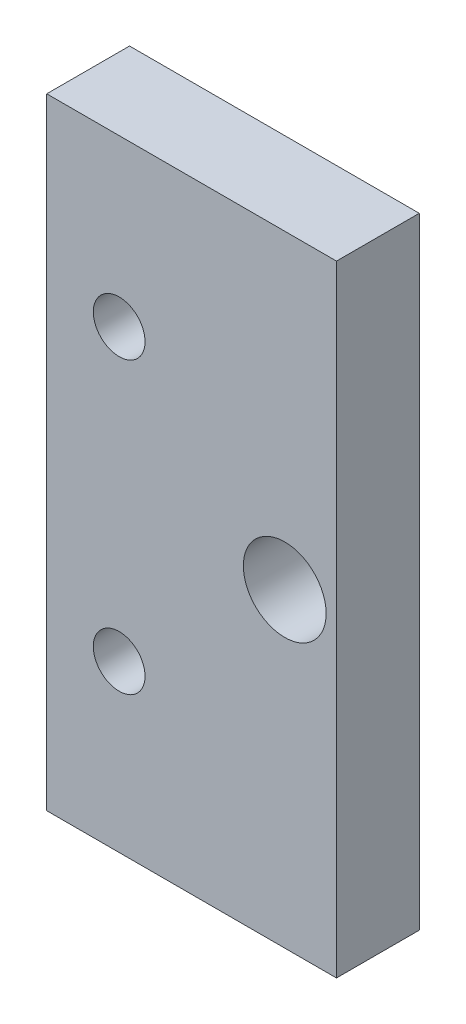
ISO-10303-21;
HEADER;
FILE_DESCRIPTION(('STEP AP214'),'2;1');
FILE_NAME('part.step','',(''),(''),'','','');
FILE_SCHEMA(('AUTOMOTIVE_DESIGN { 1 0 10303 214 1 1 1 1 }'));
ENDSEC;
DATA;
#1=APPLICATION_CONTEXT('core data for automotive mechanical design processes');
#2=APPLICATION_PROTOCOL_DEFINITION('international standard','automotive_design',2000,#1);
#3=PRODUCT_CONTEXT('',#1,'mechanical');
#4=PRODUCT('Part','Part','',(#3));
#5=PRODUCT_RELATED_PRODUCT_CATEGORY('part','',(#4));
#6=PRODUCT_DEFINITION_FORMATION('','',#4);
#7=PRODUCT_DEFINITION_CONTEXT('part definition',#1,'design');
#8=PRODUCT_DEFINITION('design','',#6,#7);
#9=PRODUCT_DEFINITION_SHAPE('','',#8);
#10=(LENGTH_UNIT() NAMED_UNIT(*) SI_UNIT(.MILLI.,.METRE.));
#11=(NAMED_UNIT(*) PLANE_ANGLE_UNIT() SI_UNIT($,.RADIAN.));
#12=(NAMED_UNIT(*) SI_UNIT($,.STERADIAN.) SOLID_ANGLE_UNIT());
#13=UNCERTAINTY_MEASURE_WITH_UNIT(LENGTH_MEASURE(1.E-05),#10,'distance_accuracy_value','');
#14=(GEOMETRIC_REPRESENTATION_CONTEXT(3) GLOBAL_UNCERTAINTY_ASSIGNED_CONTEXT((#13)) GLOBAL_UNIT_ASSIGNED_CONTEXT((#10,
#11,#12)) REPRESENTATION_CONTEXT('',''));
#15=CARTESIAN_POINT('',(0.,0.,0.));
#16=DIRECTION('',(0.,0.,1.));
#17=DIRECTION('',(1.,0.,0.));
#18=AXIS2_PLACEMENT_3D('',#15,#16,#17);
#19=CARTESIAN_POINT('',(8.89,19.05,5.08));
#20=DIRECTION('',(0.,0.,-1.));
#21=DIRECTION('',(-1.,0.,0.));
#22=AXIS2_PLACEMENT_3D('',#19,#20,#21);
#23=PLANE('',#22);
#24=CARTESIAN_POINT('',(-4.445,8.89,5.08));
#25=DIRECTION('',(0.,0.,1.));
#26=DIRECTION('',(1.,0.,0.));
#27=AXIS2_PLACEMENT_3D('',#24,#25,#26);
#28=CIRCLE('',#27,1.5875);
#29=CARTESIAN_POINT('',(-2.8575,8.89,5.08));
#30=VERTEX_POINT('',#29);
#31=EDGE_CURVE('E115',#30,#30,#28,.T.);
#32=ORIENTED_EDGE('',*,*,#31,.F.);
#33=EDGE_LOOP('',(#32));
#34=FACE_BOUND('',#33,.T.);
#35=DIRECTION('',(0.,1.,0.));
#36=VECTOR('',#35,1.);
#37=CARTESIAN_POINT('',(8.89,-19.05,5.08));
#38=LINE('',#37,#36);
#39=CARTESIAN_POINT('',(8.89,-19.05,5.08));
#40=VERTEX_POINT('',#39);
#41=CARTESIAN_POINT('',(8.89,19.05,5.08));
#42=VERTEX_POINT('',#41);
#43=EDGE_CURVE('E85',#40,#42,#38,.T.);
#44=ORIENTED_EDGE('',*,*,#43,.T.);
#45=DIRECTION('',(-1.,0.,0.));
#46=VECTOR('',#45,1.);
#47=CARTESIAN_POINT('',(-8.89,19.05,5.08));
#48=LINE('',#47,#46);
#49=CARTESIAN_POINT('',(-8.89,19.05,5.08));
#50=VERTEX_POINT('',#49);
#51=EDGE_CURVE('E80',#42,#50,#48,.T.);
#52=ORIENTED_EDGE('',*,*,#51,.T.);
#53=DIRECTION('',(0.,-1.,0.));
#54=VECTOR('',#53,1.);
#55=CARTESIAN_POINT('',(-8.89,-19.05,5.08));
#56=LINE('',#55,#54);
#57=CARTESIAN_POINT('',(-8.89,-19.05,5.08));
#58=VERTEX_POINT('',#57);
#59=EDGE_CURVE('E83',#50,#58,#56,.T.);
#60=ORIENTED_EDGE('',*,*,#59,.T.);
#61=DIRECTION('',(1.,0.,0.));
#62=VECTOR('',#61,1.);
#63=CARTESIAN_POINT('',(-8.89,-19.05,5.08));
#64=LINE('',#63,#62);
#65=EDGE_CURVE('E50',#58,#40,#64,.T.);
#66=ORIENTED_EDGE('',*,*,#65,.T.);
#67=EDGE_LOOP('',(#44,#52,#60,#66));
#68=FACE_BOUND('',#67,.T.);
#69=CARTESIAN_POINT('',(5.715,0.,5.08));
#70=DIRECTION('',(0.,0.,1.));
#71=DIRECTION('',(1.,0.,0.));
#72=AXIS2_PLACEMENT_3D('',#69,#70,#71);
#73=CIRCLE('',#72,2.54);
#74=CARTESIAN_POINT('',(8.255,0.,5.08));
#75=VERTEX_POINT('',#74);
#76=EDGE_CURVE('E100',#75,#75,#73,.T.);
#77=ORIENTED_EDGE('',*,*,#76,.F.);
#78=EDGE_LOOP('',(#77));
#79=FACE_BOUND('',#78,.T.);
#80=CARTESIAN_POINT('',(-4.445,-8.89,5.08));
#81=DIRECTION('',(0.,0.,1.));
#82=DIRECTION('',(1.,0.,0.));
#83=AXIS2_PLACEMENT_3D('',#80,#81,#82);
#84=CIRCLE('',#83,1.5875);
#85=CARTESIAN_POINT('',(-2.8575,-8.89,5.08));
#86=VERTEX_POINT('',#85);
#87=EDGE_CURVE('E121',#86,#86,#84,.T.);
#88=ORIENTED_EDGE('',*,*,#87,.F.);
#89=EDGE_LOOP('',(#88));
#90=FACE_BOUND('',#89,.T.);
#91=ADVANCED_FACE('F33',(#34,#68,#79,#90),#23,.F.);
#92=CARTESIAN_POINT('',(8.89,19.05,0.));
#93=DIRECTION('',(0.,0.,-1.));
#94=DIRECTION('',(-1.,0.,0.));
#95=AXIS2_PLACEMENT_3D('',#92,#93,#94);
#96=PLANE('',#95);
#97=CARTESIAN_POINT('',(-4.445,8.89,0.));
#98=DIRECTION('',(0.,0.,1.));
#99=DIRECTION('',(1.,0.,0.));
#100=AXIS2_PLACEMENT_3D('',#97,#98,#99);
#101=CIRCLE('',#100,1.5875);
#102=CARTESIAN_POINT('',(-2.8575,8.89,0.));
#103=VERTEX_POINT('',#102);
#104=EDGE_CURVE('E118',#103,#103,#101,.T.);
#105=ORIENTED_EDGE('',*,*,#104,.T.);
#106=EDGE_LOOP('',(#105));
#107=FACE_BOUND('',#106,.T.);
#108=DIRECTION('',(0.,1.,0.));
#109=VECTOR('',#108,1.);
#110=CARTESIAN_POINT('',(8.89,-19.05,0.));
#111=LINE('',#110,#109);
#112=CARTESIAN_POINT('',(8.89,-19.05,0.));
#113=VERTEX_POINT('',#112);
#114=CARTESIAN_POINT('',(8.89,19.05,0.));
#115=VERTEX_POINT('',#114);
#116=EDGE_CURVE('E97',#113,#115,#111,.T.);
#117=ORIENTED_EDGE('',*,*,#116,.F.);
#118=DIRECTION('',(1.,0.,0.));
#119=VECTOR('',#118,1.);
#120=CARTESIAN_POINT('',(-8.89,-19.05,0.));
#121=LINE('',#120,#119);
#122=CARTESIAN_POINT('',(-8.89,-19.05,0.));
#123=VERTEX_POINT('',#122);
#124=EDGE_CURVE('E73',#123,#113,#121,.T.);
#125=ORIENTED_EDGE('',*,*,#124,.F.);
#126=DIRECTION('',(0.,-1.,0.));
#127=VECTOR('',#126,1.);
#128=CARTESIAN_POINT('',(-8.89,-19.05,0.));
#129=LINE('',#128,#127);
#130=CARTESIAN_POINT('',(-8.89,19.05,0.));
#131=VERTEX_POINT('',#130);
#132=EDGE_CURVE('E67',#131,#123,#129,.T.);
#133=ORIENTED_EDGE('',*,*,#132,.F.);
#134=DIRECTION('',(-1.,0.,0.));
#135=VECTOR('',#134,1.);
#136=CARTESIAN_POINT('',(-8.89,19.05,0.));
#137=LINE('',#136,#135);
#138=EDGE_CURVE('E89',#115,#131,#137,.T.);
#139=ORIENTED_EDGE('',*,*,#138,.F.);
#140=EDGE_LOOP('',(#117,#125,#133,#139));
#141=FACE_BOUND('',#140,.T.);
#142=CARTESIAN_POINT('',(5.715,0.,0.));
#143=DIRECTION('',(0.,0.,1.));
#144=DIRECTION('',(1.,0.,0.));
#145=AXIS2_PLACEMENT_3D('',#142,#143,#144);
#146=CIRCLE('',#145,2.54);
#147=CARTESIAN_POINT('',(8.255,0.,0.));
#148=VERTEX_POINT('',#147);
#149=EDGE_CURVE('E112',#148,#148,#146,.T.);
#150=ORIENTED_EDGE('',*,*,#149,.T.);
#151=EDGE_LOOP('',(#150));
#152=FACE_BOUND('',#151,.T.);
#153=CARTESIAN_POINT('',(-4.445,-8.89,0.));
#154=DIRECTION('',(0.,0.,1.));
#155=DIRECTION('',(1.,0.,0.));
#156=AXIS2_PLACEMENT_3D('',#153,#154,#155);
#157=CIRCLE('',#156,1.5875);
#158=CARTESIAN_POINT('',(-2.8575,-8.89,0.));
#159=VERTEX_POINT('',#158);
#160=EDGE_CURVE('E124',#159,#159,#157,.T.);
#161=ORIENTED_EDGE('',*,*,#160,.T.);
#162=EDGE_LOOP('',(#161));
#163=FACE_BOUND('',#162,.T.);
#164=ADVANCED_FACE('F108',(#107,#141,#152,#163),#96,.T.);
#165=CARTESIAN_POINT('',(8.89,-19.05,5.08));
#166=DIRECTION('',(-1.,0.,0.));
#167=DIRECTION('',(0.,0.,1.));
#168=AXIS2_PLACEMENT_3D('',#165,#166,#167);
#169=PLANE('',#168);
#170=ORIENTED_EDGE('',*,*,#116,.T.);
#171=DIRECTION('',(0.,0.,-1.));
#172=VECTOR('',#171,1.);
#173=CARTESIAN_POINT('',(8.89,19.05,5.08));
#174=LINE('',#173,#172);
#175=EDGE_CURVE('E11',#42,#115,#174,.T.);
#176=ORIENTED_EDGE('',*,*,#175,.F.);
#177=ORIENTED_EDGE('',*,*,#43,.F.);
#178=DIRECTION('',(0.,0.,-1.));
#179=VECTOR('',#178,1.);
#180=CARTESIAN_POINT('',(8.89,-19.05,5.08));
#181=LINE('',#180,#179);
#182=EDGE_CURVE('E93',#40,#113,#181,.T.);
#183=ORIENTED_EDGE('',*,*,#182,.T.);
#184=EDGE_LOOP('',(#170,#176,#177,#183));
#185=FACE_BOUND('',#184,.T.);
#186=ADVANCED_FACE('F35',(#185),#169,.F.);
#187=CARTESIAN_POINT('',(-8.89,19.05,5.08));
#188=DIRECTION('',(0.,-1.,0.));
#189=DIRECTION('',(0.,0.,-1.));
#190=AXIS2_PLACEMENT_3D('',#187,#188,#189);
#191=PLANE('',#190);
#192=ORIENTED_EDGE('',*,*,#138,.T.);
#193=DIRECTION('',(0.,0.,-1.));
#194=VECTOR('',#193,1.);
#195=CARTESIAN_POINT('',(-8.89,19.05,5.08));
#196=LINE('',#195,#194);
#197=EDGE_CURVE('E42',#50,#131,#196,.T.);
#198=ORIENTED_EDGE('',*,*,#197,.F.);
#199=ORIENTED_EDGE('',*,*,#51,.F.);
#200=ORIENTED_EDGE('',*,*,#175,.T.);
#201=EDGE_LOOP('',(#192,#198,#199,#200));
#202=FACE_BOUND('',#201,.T.);
#203=ADVANCED_FACE('F88',(#202),#191,.F.);
#204=CARTESIAN_POINT('',(-8.89,-19.05,5.08));
#205=DIRECTION('',(1.,0.,0.));
#206=DIRECTION('',(0.,0.,-1.));
#207=AXIS2_PLACEMENT_3D('',#204,#205,#206);
#208=PLANE('',#207);
#209=ORIENTED_EDGE('',*,*,#132,.T.);
#210=DIRECTION('',(0.,0.,-1.));
#211=VECTOR('',#210,1.);
#212=CARTESIAN_POINT('',(-8.89,-19.05,5.08));
#213=LINE('',#212,#211);
#214=EDGE_CURVE('E90',#58,#123,#213,.T.);
#215=ORIENTED_EDGE('',*,*,#214,.F.);
#216=ORIENTED_EDGE('',*,*,#59,.F.);
#217=ORIENTED_EDGE('',*,*,#197,.T.);
#218=EDGE_LOOP('',(#209,#215,#216,#217));
#219=FACE_BOUND('',#218,.T.);
#220=ADVANCED_FACE('F91',(#219),#208,.F.);
#221=CARTESIAN_POINT('',(-8.89,-19.05,5.08));
#222=DIRECTION('',(0.,1.,0.));
#223=DIRECTION('',(0.,0.,1.));
#224=AXIS2_PLACEMENT_3D('',#221,#222,#223);
#225=PLANE('',#224);
#226=ORIENTED_EDGE('',*,*,#124,.T.);
#227=ORIENTED_EDGE('',*,*,#182,.F.);
#228=ORIENTED_EDGE('',*,*,#65,.F.);
#229=ORIENTED_EDGE('',*,*,#214,.T.);
#230=EDGE_LOOP('',(#226,#227,#228,#229));
#231=FACE_BOUND('',#230,.T.);
#232=ADVANCED_FACE('F105',(#231),#225,.F.);
#233=CARTESIAN_POINT('',(5.715,0.,5.08));
#234=DIRECTION('',(0.,0.,-1.));
#235=DIRECTION('',(-1.,0.,0.));
#236=AXIS2_PLACEMENT_3D('',#233,#234,#235);
#237=CYLINDRICAL_SURFACE('',#236,2.54);
#238=ORIENTED_EDGE('',*,*,#76,.T.);
#239=EDGE_LOOP('',(#238));
#240=FACE_BOUND('',#239,.T.);
#241=ORIENTED_EDGE('',*,*,#149,.F.);
#242=EDGE_LOOP('',(#241));
#243=FACE_BOUND('',#242,.T.);
#244=ADVANCED_FACE('F143',(#240,#243),#237,.F.);
#245=CARTESIAN_POINT('',(-4.445,8.89,5.08));
#246=DIRECTION('',(0.,0.,-1.));
#247=DIRECTION('',(-1.,0.,0.));
#248=AXIS2_PLACEMENT_3D('',#245,#246,#247);
#249=CYLINDRICAL_SURFACE('',#248,1.5875);
#250=ORIENTED_EDGE('',*,*,#31,.T.);
#251=EDGE_LOOP('',(#250));
#252=FACE_BOUND('',#251,.T.);
#253=ORIENTED_EDGE('',*,*,#104,.F.);
#254=EDGE_LOOP('',(#253));
#255=FACE_BOUND('',#254,.T.);
#256=ADVANCED_FACE('F189',(#252,#255),#249,.F.);
#257=CARTESIAN_POINT('',(-4.445,-8.89,5.08));
#258=DIRECTION('',(0.,0.,-1.));
#259=DIRECTION('',(-1.,0.,0.));
#260=AXIS2_PLACEMENT_3D('',#257,#258,#259);
#261=CYLINDRICAL_SURFACE('',#260,1.5875);
#262=ORIENTED_EDGE('',*,*,#87,.T.);
#263=EDGE_LOOP('',(#262));
#264=FACE_BOUND('',#263,.T.);
#265=ORIENTED_EDGE('',*,*,#160,.F.);
#266=EDGE_LOOP('',(#265));
#267=FACE_BOUND('',#266,.T.);
#268=ADVANCED_FACE('F130',(#264,#267),#261,.F.);
#269=CLOSED_SHELL('',(#91,#164,#186,#203,#220,#232,#244,#256,#268));
#270=MANIFOLD_SOLID_BREP('B2',#269);
#271=ADVANCED_BREP_SHAPE_REPRESENTATION('',(#18,#270),#14);
#272=SHAPE_DEFINITION_REPRESENTATION(#9,#271);
ENDSEC;
END-ISO-10303-21;
